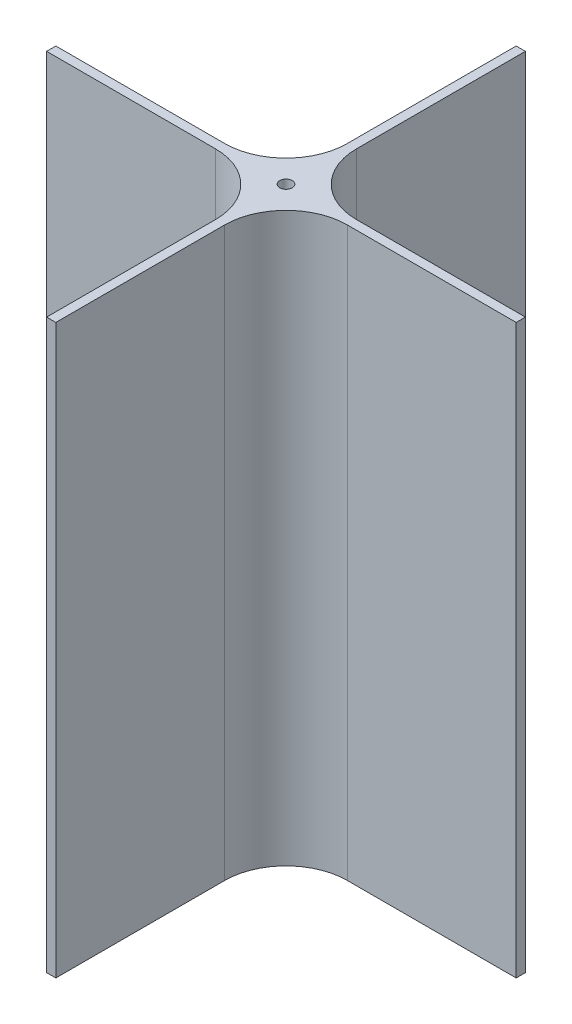
ISO-10303-21;
HEADER;
FILE_DESCRIPTION(('STEP AP214'),'2;1');
FILE_NAME('part.step','',(''),(''),'','','');
FILE_SCHEMA(('AUTOMOTIVE_DESIGN { 1 0 10303 214 1 1 1 1 }'));
ENDSEC;
DATA;
#1=APPLICATION_CONTEXT('core data for automotive mechanical design processes');
#2=APPLICATION_PROTOCOL_DEFINITION('international standard','automotive_design',2000,#1);
#3=PRODUCT_CONTEXT('',#1,'mechanical');
#4=PRODUCT('Part','Part','',(#3));
#5=PRODUCT_RELATED_PRODUCT_CATEGORY('part','',(#4));
#6=PRODUCT_DEFINITION_FORMATION('','',#4);
#7=PRODUCT_DEFINITION_CONTEXT('part definition',#1,'design');
#8=PRODUCT_DEFINITION('design','',#6,#7);
#9=PRODUCT_DEFINITION_SHAPE('','',#8);
#10=(LENGTH_UNIT() NAMED_UNIT(*) SI_UNIT(.MILLI.,.METRE.));
#11=(NAMED_UNIT(*) PLANE_ANGLE_UNIT() SI_UNIT($,.RADIAN.));
#12=(NAMED_UNIT(*) SI_UNIT($,.STERADIAN.) SOLID_ANGLE_UNIT());
#13=UNCERTAINTY_MEASURE_WITH_UNIT(LENGTH_MEASURE(1.E-05),#10,'distance_accuracy_value','');
#14=(GEOMETRIC_REPRESENTATION_CONTEXT(3) GLOBAL_UNCERTAINTY_ASSIGNED_CONTEXT((#13)) GLOBAL_UNIT_ASSIGNED_CONTEXT((#10,
#11,#12)) REPRESENTATION_CONTEXT('',''));
#15=CARTESIAN_POINT('',(0.,0.,0.));
#16=DIRECTION('',(0.,0.,1.));
#17=DIRECTION('',(1.,0.,0.));
#18=AXIS2_PLACEMENT_3D('',#15,#16,#17);
#19=CARTESIAN_POINT('',(-76.5,185.,-1.49999999999999));
#20=DIRECTION('',(0.,0.,1.));
#21=DIRECTION('',(1.,0.,0.));
#22=AXIS2_PLACEMENT_3D('',#19,#20,#21);
#23=PLANE('',#22);
#24=DIRECTION('',(-1.,0.,0.));
#25=VECTOR('',#24,1.);
#26=CARTESIAN_POINT('',(-76.5,185.,-1.49999999999999));
#27=LINE('',#26,#25);
#28=CARTESIAN_POINT('',(-21.5,185.,-1.5));
#29=VERTEX_POINT('',#28);
#30=CARTESIAN_POINT('',(-76.5,185.,-1.49999999999999));
#31=VERTEX_POINT('',#30);
#32=EDGE_CURVE('E242',#29,#31,#27,.T.);
#33=ORIENTED_EDGE('',*,*,#32,.F.);
#34=DIRECTION('',(0.,-1.,0.));
#35=VECTOR('',#34,1.);
#36=CARTESIAN_POINT('',(-21.5,0.,-1.5));
#37=LINE('',#36,#35);
#38=CARTESIAN_POINT('',(-21.5,0.,-1.5));
#39=VERTEX_POINT('',#38);
#40=EDGE_CURVE('E321',#29,#39,#37,.T.);
#41=ORIENTED_EDGE('',*,*,#40,.T.);
#42=DIRECTION('',(-1.,0.,0.));
#43=VECTOR('',#42,1.);
#44=CARTESIAN_POINT('',(-76.5,0.,-1.49999999999999));
#45=LINE('',#44,#43);
#46=CARTESIAN_POINT('',(-76.5,0.,-1.49999999999999));
#47=VERTEX_POINT('',#46);
#48=EDGE_CURVE('E239',#39,#47,#45,.T.);
#49=ORIENTED_EDGE('',*,*,#48,.T.);
#50=DIRECTION('',(0.,-1.,0.));
#51=VECTOR('',#50,1.);
#52=CARTESIAN_POINT('',(-76.5,185.,-1.49999999999999));
#53=LINE('',#52,#51);
#54=EDGE_CURVE('E318',#31,#47,#53,.T.);
#55=ORIENTED_EDGE('',*,*,#54,.F.);
#56=EDGE_LOOP('',(#33,#41,#49,#55));
#57=FACE_BOUND('',#56,.T.);
#58=ADVANCED_FACE('F38',(#57),#23,.F.);
#59=CARTESIAN_POINT('',(-76.5,185.,1.50000000000001));
#60=DIRECTION('',(1.,0.,0.));
#61=DIRECTION('',(0.,0.,-1.));
#62=AXIS2_PLACEMENT_3D('',#59,#60,#61);
#63=PLANE('',#62);
#64=DIRECTION('',(0.,0.,1.));
#65=VECTOR('',#64,1.);
#66=CARTESIAN_POINT('',(-76.5,0.,1.50000000000001));
#67=LINE('',#66,#65);
#68=CARTESIAN_POINT('',(-76.5,0.,1.50000000000001));
#69=VERTEX_POINT('',#68);
#70=EDGE_CURVE('E273',#47,#69,#67,.T.);
#71=ORIENTED_EDGE('',*,*,#70,.T.);
#72=DIRECTION('',(0.,-1.,0.));
#73=VECTOR('',#72,1.);
#74=CARTESIAN_POINT('',(-76.5,185.,1.50000000000001));
#75=LINE('',#74,#73);
#76=CARTESIAN_POINT('',(-76.5,185.,1.50000000000001));
#77=VERTEX_POINT('',#76);
#78=EDGE_CURVE('E315',#77,#69,#75,.T.);
#79=ORIENTED_EDGE('',*,*,#78,.F.);
#80=DIRECTION('',(0.,0.,1.));
#81=VECTOR('',#80,1.);
#82=CARTESIAN_POINT('',(-76.5,185.,1.50000000000001));
#83=LINE('',#82,#81);
#84=EDGE_CURVE('E244',#31,#77,#83,.T.);
#85=ORIENTED_EDGE('',*,*,#84,.F.);
#86=ORIENTED_EDGE('',*,*,#54,.T.);
#87=EDGE_LOOP('',(#71,#79,#85,#86));
#88=FACE_BOUND('',#87,.T.);
#89=ADVANCED_FACE('F427',(#88),#63,.F.);
#90=CARTESIAN_POINT('',(-1.5,185.,1.5));
#91=DIRECTION('',(0.,0.,-1.));
#92=DIRECTION('',(-1.,0.,0.));
#93=AXIS2_PLACEMENT_3D('',#90,#91,#92);
#94=PLANE('',#93);
#95=DIRECTION('',(1.,0.,0.));
#96=VECTOR('',#95,1.);
#97=CARTESIAN_POINT('',(-1.5,0.,1.5));
#98=LINE('',#97,#96);
#99=CARTESIAN_POINT('',(-21.5,0.,1.5));
#100=VERTEX_POINT('',#99);
#101=EDGE_CURVE('E275',#69,#100,#98,.T.);
#102=ORIENTED_EDGE('',*,*,#101,.T.);
#103=DIRECTION('',(0.,-1.,0.));
#104=VECTOR('',#103,1.);
#105=CARTESIAN_POINT('',(-21.5,185.,1.5));
#106=LINE('',#105,#104);
#107=CARTESIAN_POINT('',(-21.5,185.,1.5));
#108=VERTEX_POINT('',#107);
#109=EDGE_CURVE('E339',#100,#108,#106,.F.);
#110=ORIENTED_EDGE('',*,*,#109,.T.);
#111=DIRECTION('',(1.,0.,0.));
#112=VECTOR('',#111,1.);
#113=CARTESIAN_POINT('',(-1.5,185.,1.5));
#114=LINE('',#113,#112);
#115=EDGE_CURVE('E247',#77,#108,#114,.T.);
#116=ORIENTED_EDGE('',*,*,#115,.F.);
#117=ORIENTED_EDGE('',*,*,#78,.T.);
#118=EDGE_LOOP('',(#102,#110,#116,#117));
#119=FACE_BOUND('',#118,.T.);
#120=ADVANCED_FACE('F362',(#119),#94,.F.);
#121=CARTESIAN_POINT('',(-1.5,185.,76.5));
#122=DIRECTION('',(1.,0.,0.));
#123=DIRECTION('',(0.,0.,-1.));
#124=AXIS2_PLACEMENT_3D('',#121,#122,#123);
#125=PLANE('',#124);
#126=DIRECTION('',(0.,0.,1.));
#127=VECTOR('',#126,1.);
#128=CARTESIAN_POINT('',(-1.5,185.,76.5));
#129=LINE('',#128,#127);
#130=CARTESIAN_POINT('',(-1.5,185.,21.5));
#131=VERTEX_POINT('',#130);
#132=CARTESIAN_POINT('',(-1.5,185.,76.5));
#133=VERTEX_POINT('',#132);
#134=EDGE_CURVE('E250',#131,#133,#129,.T.);
#135=ORIENTED_EDGE('',*,*,#134,.F.);
#136=DIRECTION('',(0.,-1.,0.));
#137=VECTOR('',#136,1.);
#138=CARTESIAN_POINT('',(-1.5,0.,21.5));
#139=LINE('',#138,#137);
#140=CARTESIAN_POINT('',(-1.5,0.,21.5));
#141=VERTEX_POINT('',#140);
#142=EDGE_CURVE('E336',#131,#141,#139,.T.);
#143=ORIENTED_EDGE('',*,*,#142,.T.);
#144=DIRECTION('',(0.,0.,1.));
#145=VECTOR('',#144,1.);
#146=CARTESIAN_POINT('',(-1.5,0.,76.5));
#147=LINE('',#146,#145);
#148=CARTESIAN_POINT('',(-1.5,0.,76.5));
#149=VERTEX_POINT('',#148);
#150=EDGE_CURVE('E278',#141,#149,#147,.T.);
#151=ORIENTED_EDGE('',*,*,#150,.T.);
#152=DIRECTION('',(0.,-1.,0.));
#153=VECTOR('',#152,1.);
#154=CARTESIAN_POINT('',(-1.5,185.,76.5));
#155=LINE('',#154,#153);
#156=EDGE_CURVE('E312',#133,#149,#155,.T.);
#157=ORIENTED_EDGE('',*,*,#156,.F.);
#158=EDGE_LOOP('',(#135,#143,#151,#157));
#159=FACE_BOUND('',#158,.T.);
#160=ADVANCED_FACE('F371',(#159),#125,.F.);
#161=CARTESIAN_POINT('',(1.5,185.,76.5));
#162=DIRECTION('',(0.,0.,-1.));
#163=DIRECTION('',(-1.,0.,0.));
#164=AXIS2_PLACEMENT_3D('',#161,#162,#163);
#165=PLANE('',#164);
#166=DIRECTION('',(1.,0.,0.));
#167=VECTOR('',#166,1.);
#168=CARTESIAN_POINT('',(1.5,0.,76.5));
#169=LINE('',#168,#167);
#170=CARTESIAN_POINT('',(1.5,0.,76.5));
#171=VERTEX_POINT('',#170);
#172=EDGE_CURVE('E280',#149,#171,#169,.T.);
#173=ORIENTED_EDGE('',*,*,#172,.T.);
#174=DIRECTION('',(0.,-1.,0.));
#175=VECTOR('',#174,1.);
#176=CARTESIAN_POINT('',(1.5,185.,76.5));
#177=LINE('',#176,#175);
#178=CARTESIAN_POINT('',(1.5,185.,76.5));
#179=VERTEX_POINT('',#178);
#180=EDGE_CURVE('E309',#179,#171,#177,.T.);
#181=ORIENTED_EDGE('',*,*,#180,.F.);
#182=DIRECTION('',(1.,0.,0.));
#183=VECTOR('',#182,1.);
#184=CARTESIAN_POINT('',(1.5,185.,76.5));
#185=LINE('',#184,#183);
#186=EDGE_CURVE('E252',#133,#179,#185,.T.);
#187=ORIENTED_EDGE('',*,*,#186,.F.);
#188=ORIENTED_EDGE('',*,*,#156,.T.);
#189=EDGE_LOOP('',(#173,#181,#187,#188));
#190=FACE_BOUND('',#189,.T.);
#191=ADVANCED_FACE('F375',(#190),#165,.F.);
#192=CARTESIAN_POINT('',(1.5,185.,1.5));
#193=DIRECTION('',(-1.,0.,0.));
#194=DIRECTION('',(0.,0.,1.));
#195=AXIS2_PLACEMENT_3D('',#192,#193,#194);
#196=PLANE('',#195);
#197=DIRECTION('',(0.,0.,-1.));
#198=VECTOR('',#197,1.);
#199=CARTESIAN_POINT('',(1.5,0.,1.5));
#200=LINE('',#199,#198);
#201=CARTESIAN_POINT('',(1.5,0.,21.5));
#202=VERTEX_POINT('',#201);
#203=EDGE_CURVE('E282',#171,#202,#200,.T.);
#204=ORIENTED_EDGE('',*,*,#203,.T.);
#205=DIRECTION('',(0.,-1.,0.));
#206=VECTOR('',#205,1.);
#207=CARTESIAN_POINT('',(1.5,185.,21.5));
#208=LINE('',#207,#206);
#209=CARTESIAN_POINT('',(1.5,185.,21.5));
#210=VERTEX_POINT('',#209);
#211=EDGE_CURVE('E329',#202,#210,#208,.F.);
#212=ORIENTED_EDGE('',*,*,#211,.T.);
#213=DIRECTION('',(0.,0.,-1.));
#214=VECTOR('',#213,1.);
#215=CARTESIAN_POINT('',(1.5,185.,1.5));
#216=LINE('',#215,#214);
#217=EDGE_CURVE('E254',#179,#210,#216,.T.);
#218=ORIENTED_EDGE('',*,*,#217,.F.);
#219=ORIENTED_EDGE('',*,*,#180,.T.);
#220=EDGE_LOOP('',(#204,#212,#218,#219));
#221=FACE_BOUND('',#220,.T.);
#222=ADVANCED_FACE('F505',(#221),#196,.F.);
#223=CARTESIAN_POINT('',(76.5,185.,1.49999999999999));
#224=DIRECTION('',(0.,0.,-1.));
#225=DIRECTION('',(-1.,0.,0.));
#226=AXIS2_PLACEMENT_3D('',#223,#224,#225);
#227=PLANE('',#226);
#228=DIRECTION('',(1.,0.,0.));
#229=VECTOR('',#228,1.);
#230=CARTESIAN_POINT('',(76.5,185.,1.49999999999999));
#231=LINE('',#230,#229);
#232=CARTESIAN_POINT('',(21.5,185.,1.5));
#233=VERTEX_POINT('',#232);
#234=CARTESIAN_POINT('',(76.5,185.,1.49999999999999));
#235=VERTEX_POINT('',#234);
#236=EDGE_CURVE('E257',#233,#235,#231,.T.);
#237=ORIENTED_EDGE('',*,*,#236,.F.);
#238=DIRECTION('',(0.,-1.,0.));
#239=VECTOR('',#238,1.);
#240=CARTESIAN_POINT('',(21.5,0.,1.5));
#241=LINE('',#240,#239);
#242=CARTESIAN_POINT('',(21.5,0.,1.5));
#243=VERTEX_POINT('',#242);
#244=EDGE_CURVE('E326',#233,#243,#241,.T.);
#245=ORIENTED_EDGE('',*,*,#244,.T.);
#246=DIRECTION('',(1.,0.,0.));
#247=VECTOR('',#246,1.);
#248=CARTESIAN_POINT('',(76.5,0.,1.49999999999999));
#249=LINE('',#248,#247);
#250=CARTESIAN_POINT('',(76.5,0.,1.49999999999999));
#251=VERTEX_POINT('',#250);
#252=EDGE_CURVE('E285',#243,#251,#249,.T.);
#253=ORIENTED_EDGE('',*,*,#252,.T.);
#254=DIRECTION('',(0.,-1.,0.));
#255=VECTOR('',#254,1.);
#256=CARTESIAN_POINT('',(76.5,185.,1.49999999999999));
#257=LINE('',#256,#255);
#258=EDGE_CURVE('E306',#235,#251,#257,.T.);
#259=ORIENTED_EDGE('',*,*,#258,.F.);
#260=EDGE_LOOP('',(#237,#245,#253,#259));
#261=FACE_BOUND('',#260,.T.);
#262=ADVANCED_FACE('F386',(#261),#227,.F.);
#263=CARTESIAN_POINT('',(76.5,185.,-1.50000000000001));
#264=DIRECTION('',(-1.,0.,0.));
#265=DIRECTION('',(0.,0.,1.));
#266=AXIS2_PLACEMENT_3D('',#263,#264,#265);
#267=PLANE('',#266);
#268=DIRECTION('',(0.,0.,-1.));
#269=VECTOR('',#268,1.);
#270=CARTESIAN_POINT('',(76.5,0.,-1.50000000000001));
#271=LINE('',#270,#269);
#272=CARTESIAN_POINT('',(76.5,0.,-1.50000000000001));
#273=VERTEX_POINT('',#272);
#274=EDGE_CURVE('E287',#251,#273,#271,.T.);
#275=ORIENTED_EDGE('',*,*,#274,.T.);
#276=DIRECTION('',(0.,-1.,0.));
#277=VECTOR('',#276,1.);
#278=CARTESIAN_POINT('',(76.5,185.,-1.50000000000001));
#279=LINE('',#278,#277);
#280=CARTESIAN_POINT('',(76.5,185.,-1.50000000000001));
#281=VERTEX_POINT('',#280);
#282=EDGE_CURVE('E303',#281,#273,#279,.T.);
#283=ORIENTED_EDGE('',*,*,#282,.F.);
#284=DIRECTION('',(0.,0.,-1.));
#285=VECTOR('',#284,1.);
#286=CARTESIAN_POINT('',(76.5,185.,-1.50000000000001));
#287=LINE('',#286,#285);
#288=EDGE_CURVE('E259',#235,#281,#287,.T.);
#289=ORIENTED_EDGE('',*,*,#288,.F.);
#290=ORIENTED_EDGE('',*,*,#258,.T.);
#291=EDGE_LOOP('',(#275,#283,#289,#290));
#292=FACE_BOUND('',#291,.T.);
#293=ADVANCED_FACE('F393',(#292),#267,.F.);
#294=CARTESIAN_POINT('',(1.5,185.,-1.49999999999998));
#295=DIRECTION('',(0.,0.,1.));
#296=DIRECTION('',(1.,0.,0.));
#297=AXIS2_PLACEMENT_3D('',#294,#295,#296);
#298=PLANE('',#297);
#299=DIRECTION('',(-1.,0.,0.));
#300=VECTOR('',#299,1.);
#301=CARTESIAN_POINT('',(1.5,0.,-1.49999999999998));
#302=LINE('',#301,#300);
#303=CARTESIAN_POINT('',(21.5,0.,-1.49999999999999));
#304=VERTEX_POINT('',#303);
#305=EDGE_CURVE('E289',#273,#304,#302,.T.);
#306=ORIENTED_EDGE('',*,*,#305,.T.);
#307=DIRECTION('',(0.,-1.,0.));
#308=VECTOR('',#307,1.);
#309=CARTESIAN_POINT('',(21.5,185.,-1.49999999999999));
#310=LINE('',#309,#308);
#311=CARTESIAN_POINT('',(21.5,185.,-1.49999999999999));
#312=VERTEX_POINT('',#311);
#313=EDGE_CURVE('E334',#304,#312,#310,.F.);
#314=ORIENTED_EDGE('',*,*,#313,.T.);
#315=DIRECTION('',(-1.,0.,0.));
#316=VECTOR('',#315,1.);
#317=CARTESIAN_POINT('',(1.5,185.,-1.49999999999998));
#318=LINE('',#317,#316);
#319=EDGE_CURVE('E261',#281,#312,#318,.T.);
#320=ORIENTED_EDGE('',*,*,#319,.F.);
#321=ORIENTED_EDGE('',*,*,#282,.T.);
#322=EDGE_LOOP('',(#306,#314,#320,#321));
#323=FACE_BOUND('',#322,.T.);
#324=ADVANCED_FACE('F397',(#323),#298,.F.);
#325=CARTESIAN_POINT('',(1.5,185.,-76.5));
#326=DIRECTION('',(-1.,0.,0.));
#327=DIRECTION('',(0.,0.,1.));
#328=AXIS2_PLACEMENT_3D('',#325,#326,#327);
#329=PLANE('',#328);
#330=DIRECTION('',(0.,0.,-1.));
#331=VECTOR('',#330,1.);
#332=CARTESIAN_POINT('',(1.5,185.,-76.5));
#333=LINE('',#332,#331);
#334=CARTESIAN_POINT('',(1.5,185.,-21.5));
#335=VERTEX_POINT('',#334);
#336=CARTESIAN_POINT('',(1.5,185.,-76.5));
#337=VERTEX_POINT('',#336);
#338=EDGE_CURVE('E264',#335,#337,#333,.T.);
#339=ORIENTED_EDGE('',*,*,#338,.F.);
#340=DIRECTION('',(0.,-1.,0.));
#341=VECTOR('',#340,1.);
#342=CARTESIAN_POINT('',(1.5,0.,-21.5));
#343=LINE('',#342,#341);
#344=CARTESIAN_POINT('',(1.5,0.,-21.5));
#345=VERTEX_POINT('',#344);
#346=EDGE_CURVE('E331',#335,#345,#343,.T.);
#347=ORIENTED_EDGE('',*,*,#346,.T.);
#348=DIRECTION('',(0.,0.,-1.));
#349=VECTOR('',#348,1.);
#350=CARTESIAN_POINT('',(1.5,0.,-76.5));
#351=LINE('',#350,#349);
#352=CARTESIAN_POINT('',(1.5,0.,-76.5));
#353=VERTEX_POINT('',#352);
#354=EDGE_CURVE('E292',#345,#353,#351,.T.);
#355=ORIENTED_EDGE('',*,*,#354,.T.);
#356=DIRECTION('',(0.,-1.,0.));
#357=VECTOR('',#356,1.);
#358=CARTESIAN_POINT('',(1.5,185.,-76.5));
#359=LINE('',#358,#357);
#360=EDGE_CURVE('E300',#337,#353,#359,.T.);
#361=ORIENTED_EDGE('',*,*,#360,.F.);
#362=EDGE_LOOP('',(#339,#347,#355,#361));
#363=FACE_BOUND('',#362,.T.);
#364=ADVANCED_FACE('F406',(#363),#329,.F.);
#365=CARTESIAN_POINT('',(-1.5,185.,-76.5));
#366=DIRECTION('',(0.,0.,1.));
#367=DIRECTION('',(1.,0.,0.));
#368=AXIS2_PLACEMENT_3D('',#365,#366,#367);
#369=PLANE('',#368);
#370=DIRECTION('',(-1.,0.,0.));
#371=VECTOR('',#370,1.);
#372=CARTESIAN_POINT('',(-1.5,0.,-76.5));
#373=LINE('',#372,#371);
#374=CARTESIAN_POINT('',(-1.5,0.,-76.5));
#375=VERTEX_POINT('',#374);
#376=EDGE_CURVE('E294',#353,#375,#373,.T.);
#377=ORIENTED_EDGE('',*,*,#376,.T.);
#378=DIRECTION('',(0.,-1.,0.));
#379=VECTOR('',#378,1.);
#380=CARTESIAN_POINT('',(-1.5,185.,-76.5));
#381=LINE('',#380,#379);
#382=CARTESIAN_POINT('',(-1.5,185.,-76.5));
#383=VERTEX_POINT('',#382);
#384=EDGE_CURVE('E271',#383,#375,#381,.T.);
#385=ORIENTED_EDGE('',*,*,#384,.F.);
#386=DIRECTION('',(-1.,0.,0.));
#387=VECTOR('',#386,1.);
#388=CARTESIAN_POINT('',(-1.5,185.,-76.5));
#389=LINE('',#388,#387);
#390=EDGE_CURVE('E266',#337,#383,#389,.T.);
#391=ORIENTED_EDGE('',*,*,#390,.F.);
#392=ORIENTED_EDGE('',*,*,#360,.T.);
#393=EDGE_LOOP('',(#377,#385,#391,#392));
#394=FACE_BOUND('',#393,.T.);
#395=ADVANCED_FACE('F412',(#394),#369,.F.);
#396=CARTESIAN_POINT('',(-1.5,185.,-1.5));
#397=DIRECTION('',(1.,0.,0.));
#398=DIRECTION('',(0.,0.,-1.));
#399=AXIS2_PLACEMENT_3D('',#396,#397,#398);
#400=PLANE('',#399);
#401=DIRECTION('',(0.,0.,1.));
#402=VECTOR('',#401,1.);
#403=CARTESIAN_POINT('',(-1.5,0.,-1.5));
#404=LINE('',#403,#402);
#405=CARTESIAN_POINT('',(-1.5,0.,-21.5));
#406=VERTEX_POINT('',#405);
#407=EDGE_CURVE('E245',#375,#406,#404,.T.);
#408=ORIENTED_EDGE('',*,*,#407,.T.);
#409=DIRECTION('',(0.,-1.,0.));
#410=VECTOR('',#409,1.);
#411=CARTESIAN_POINT('',(-1.5,185.,-21.5));
#412=LINE('',#411,#410);
#413=CARTESIAN_POINT('',(-1.5,185.,-21.5));
#414=VERTEX_POINT('',#413);
#415=EDGE_CURVE('E324',#406,#414,#412,.F.);
#416=ORIENTED_EDGE('',*,*,#415,.T.);
#417=DIRECTION('',(0.,0.,1.));
#418=VECTOR('',#417,1.);
#419=CARTESIAN_POINT('',(-1.5,185.,-1.5));
#420=LINE('',#419,#418);
#421=EDGE_CURVE('E268',#383,#414,#420,.T.);
#422=ORIENTED_EDGE('',*,*,#421,.F.);
#423=ORIENTED_EDGE('',*,*,#384,.T.);
#424=EDGE_LOOP('',(#408,#416,#422,#423));
#425=FACE_BOUND('',#424,.T.);
#426=ADVANCED_FACE('F416',(#425),#400,.F.);
#427=CARTESIAN_POINT('',(0.,185.,0.));
#428=DIRECTION('',(0.,1.,0.));
#429=DIRECTION('',(0.,0.,1.));
#430=AXIS2_PLACEMENT_3D('',#427,#428,#429);
#431=PLANE('',#430);
#432=CARTESIAN_POINT('',(0.,185.,0.));
#433=DIRECTION('',(0.,1.,0.));
#434=DIRECTION('',(0.,0.,1.));
#435=AXIS2_PLACEMENT_3D('',#432,#433,#434);
#436=CIRCLE('',#435,2.05);
#437=CARTESIAN_POINT('',(0.,185.,2.05));
#438=VERTEX_POINT('',#437);
#439=EDGE_CURVE('E692',#438,#438,#436,.T.);
#440=ORIENTED_EDGE('',*,*,#439,.F.);
#441=EDGE_LOOP('',(#440));
#442=FACE_BOUND('',#441,.T.);
#443=ORIENTED_EDGE('',*,*,#421,.T.);
#444=CARTESIAN_POINT('',(-21.5,185.,-21.5));
#445=DIRECTION('',(0.,1.,0.));
#446=DIRECTION('',(0.,0.,1.));
#447=AXIS2_PLACEMENT_3D('',#444,#445,#446);
#448=CIRCLE('',#447,20.);
#449=EDGE_CURVE('E343',#414,#29,#448,.F.);
#450=ORIENTED_EDGE('',*,*,#449,.T.);
#451=ORIENTED_EDGE('',*,*,#32,.T.);
#452=ORIENTED_EDGE('',*,*,#84,.T.);
#453=ORIENTED_EDGE('',*,*,#115,.T.);
#454=CARTESIAN_POINT('',(-21.5,185.,21.5));
#455=DIRECTION('',(0.,1.,0.));
#456=DIRECTION('',(0.,0.,1.));
#457=AXIS2_PLACEMENT_3D('',#454,#455,#456);
#458=CIRCLE('',#457,20.);
#459=EDGE_CURVE('E11',#108,#131,#458,.F.);
#460=ORIENTED_EDGE('',*,*,#459,.T.);
#461=ORIENTED_EDGE('',*,*,#134,.T.);
#462=ORIENTED_EDGE('',*,*,#186,.T.);
#463=ORIENTED_EDGE('',*,*,#217,.T.);
#464=CARTESIAN_POINT('',(21.5,185.,21.5));
#465=DIRECTION('',(0.,1.,0.));
#466=DIRECTION('',(0.,0.,1.));
#467=AXIS2_PLACEMENT_3D('',#464,#465,#466);
#468=CIRCLE('',#467,20.);
#469=EDGE_CURVE('E347',#210,#233,#468,.F.);
#470=ORIENTED_EDGE('',*,*,#469,.T.);
#471=ORIENTED_EDGE('',*,*,#236,.T.);
#472=ORIENTED_EDGE('',*,*,#288,.T.);
#473=ORIENTED_EDGE('',*,*,#319,.T.);
#474=CARTESIAN_POINT('',(21.5,185.,-21.5));
#475=DIRECTION('',(0.,1.,0.));
#476=DIRECTION('',(0.,0.,1.));
#477=AXIS2_PLACEMENT_3D('',#474,#475,#476);
#478=CIRCLE('',#477,20.);
#479=EDGE_CURVE('E351',#312,#335,#478,.F.);
#480=ORIENTED_EDGE('',*,*,#479,.T.);
#481=ORIENTED_EDGE('',*,*,#338,.T.);
#482=ORIENTED_EDGE('',*,*,#390,.T.);
#483=EDGE_LOOP('',(#443,#450,#451,#452,#453,#460,#461,#462,#463,#470,#471,#472,#473,#480,#481,#482));
#484=FACE_BOUND('',#483,.T.);
#485=ADVANCED_FACE('F368',(#442,#484),#431,.T.);
#486=CARTESIAN_POINT('',(0.,0.,0.));
#487=DIRECTION('',(0.,1.,0.));
#488=DIRECTION('',(0.,0.,1.));
#489=AXIS2_PLACEMENT_3D('',#486,#487,#488);
#490=PLANE('',#489);
#491=DIRECTION('',(0.707106781186547,0.,-0.707106781186548));
#492=VECTOR('',#491,1.);
#493=CARTESIAN_POINT('',(-4.59619407771256,0.,-1.76776695296637));
#494=LINE('',#493,#492);
#495=CARTESIAN_POINT('',(-4.59619407771256,0.,-1.76776695296637));
#496=VERTEX_POINT('',#495);
#497=CARTESIAN_POINT('',(-1.76776695296637,0.,-4.59619407771256));
#498=VERTEX_POINT('',#497);
#499=EDGE_CURVE('E209',#496,#498,#494,.T.);
#500=ORIENTED_EDGE('',*,*,#499,.F.);
#501=DIRECTION('',(-0.707106781186546,0.,-0.707106781186549));
#502=VECTOR('',#501,1.);
#503=CARTESIAN_POINT('',(-3.88908729652601,0.,-1.06066017177982));
#504=LINE('',#503,#502);
#505=CARTESIAN_POINT('',(-3.88908729652601,0.,-1.06066017177982));
#506=VERTEX_POINT('',#505);
#507=EDGE_CURVE('E58',#506,#496,#504,.T.);
#508=ORIENTED_EDGE('',*,*,#507,.F.);
#509=DIRECTION('',(-0.707106781186547,0.,0.707106781186548));
#510=VECTOR('',#509,1.);
#511=CARTESIAN_POINT('',(-3.88908729652601,0.,-1.06066017177982));
#512=LINE('',#511,#510);
#513=CARTESIAN_POINT('',(-1.06066017177982,0.,-3.88908729652601));
#514=VERTEX_POINT('',#513);
#515=EDGE_CURVE('E198',#514,#506,#512,.T.);
#516=ORIENTED_EDGE('',*,*,#515,.F.);
#517=DIRECTION('',(0.707106781186548,0.,0.707106781186547));
#518=VECTOR('',#517,1.);
#519=CARTESIAN_POINT('',(-1.06066017177982,0.,-3.88908729652601));
#520=LINE('',#519,#518);
#521=EDGE_CURVE('E203',#498,#514,#520,.T.);
#522=ORIENTED_EDGE('',*,*,#521,.F.);
#523=EDGE_LOOP('',(#500,#508,#516,#522));
#524=FACE_BOUND('',#523,.T.);
#525=DIRECTION('',(0.707106781186548,0.,-0.707106781186548));
#526=VECTOR('',#525,1.);
#527=CARTESIAN_POINT('',(-1.99607451847331,0.,-0.125245825086335));
#528=LINE('',#527,#526);
#529=CARTESIAN_POINT('',(-1.99607451847331,0.,-0.125245825086335));
#530=VERTEX_POINT('',#529);
#531=CARTESIAN_POINT('',(-0.125245825086335,0.,-1.99607451847331));
#532=VERTEX_POINT('',#531);
#533=EDGE_CURVE('E212',#530,#532,#528,.T.);
#534=ORIENTED_EDGE('',*,*,#533,.F.);
#535=CARTESIAN_POINT('',(0.,0.,0.));
#536=DIRECTION('',(0.,-1.,0.));
#537=DIRECTION('',(0.,0.,1.));
#538=AXIS2_PLACEMENT_3D('',#535,#536,#537);
#539=CIRCLE('',#538,2.);
#540=EDGE_CURVE('E210',#532,#530,#539,.T.);
#541=ORIENTED_EDGE('',*,*,#540,.F.);
#542=EDGE_LOOP('',(#534,#541));
#543=FACE_BOUND('',#542,.T.);
#544=ORIENTED_EDGE('',*,*,#48,.F.);
#545=CARTESIAN_POINT('',(-21.5,0.,-21.5));
#546=DIRECTION('',(0.,1.,0.));
#547=DIRECTION('',(0.,0.,1.));
#548=AXIS2_PLACEMENT_3D('',#545,#546,#547);
#549=CIRCLE('',#548,20.);
#550=EDGE_CURVE('E341',#39,#406,#549,.T.);
#551=ORIENTED_EDGE('',*,*,#550,.T.);
#552=ORIENTED_EDGE('',*,*,#407,.F.);
#553=ORIENTED_EDGE('',*,*,#376,.F.);
#554=ORIENTED_EDGE('',*,*,#354,.F.);
#555=CARTESIAN_POINT('',(21.5,0.,-21.5));
#556=DIRECTION('',(0.,1.,0.));
#557=DIRECTION('',(0.,0.,1.));
#558=AXIS2_PLACEMENT_3D('',#555,#556,#557);
#559=CIRCLE('',#558,20.);
#560=EDGE_CURVE('E349',#345,#304,#559,.T.);
#561=ORIENTED_EDGE('',*,*,#560,.T.);
#562=ORIENTED_EDGE('',*,*,#305,.F.);
#563=ORIENTED_EDGE('',*,*,#274,.F.);
#564=ORIENTED_EDGE('',*,*,#252,.F.);
#565=CARTESIAN_POINT('',(21.5,0.,21.5));
#566=DIRECTION('',(0.,1.,0.));
#567=DIRECTION('',(0.,0.,1.));
#568=AXIS2_PLACEMENT_3D('',#565,#566,#567);
#569=CIRCLE('',#568,20.);
#570=EDGE_CURVE('E345',#243,#202,#569,.T.);
#571=ORIENTED_EDGE('',*,*,#570,.T.);
#572=ORIENTED_EDGE('',*,*,#203,.F.);
#573=ORIENTED_EDGE('',*,*,#172,.F.);
#574=ORIENTED_EDGE('',*,*,#150,.F.);
#575=CARTESIAN_POINT('',(-21.5,0.,21.5));
#576=DIRECTION('',(0.,1.,0.));
#577=DIRECTION('',(0.,0.,1.));
#578=AXIS2_PLACEMENT_3D('',#575,#576,#577);
#579=CIRCLE('',#578,20.);
#580=EDGE_CURVE('E46',#141,#100,#579,.T.);
#581=ORIENTED_EDGE('',*,*,#580,.T.);
#582=ORIENTED_EDGE('',*,*,#101,.F.);
#583=ORIENTED_EDGE('',*,*,#70,.F.);
#584=EDGE_LOOP('',(#544,#551,#552,#553,#554,#561,#562,#563,#564,#571,#572,#573,#574,#581,#582,#583));
#585=FACE_BOUND('',#584,.T.);
#586=ADVANCED_FACE('F206',(#524,#543,#585),#490,.F.);
#587=CARTESIAN_POINT('',(-21.5,185.,-21.5));
#588=DIRECTION('',(0.,1.,0.));
#589=DIRECTION('',(0.,0.,1.));
#590=AXIS2_PLACEMENT_3D('',#587,#588,#589);
#591=CYLINDRICAL_SURFACE('',#590,20.);
#592=CARTESIAN_POINT('',(-6.33703505204973,11.5,-8.45835539560937));
#593=CARTESIAN_POINT('',(-6.33703712926371,11.5841284342779,-8.45835225839734));
#594=CARTESIAN_POINT('',(-6.34167603836318,11.6683148517946,-8.45295349618822));
#595=CARTESIAN_POINT('',(-6.36014533781777,11.8343604156479,-8.43152674774005));
#596=CARTESIAN_POINT('',(-6.37398626615615,11.916216781448,-8.41548657519849));
#597=CARTESIAN_POINT('',(-6.41055160961536,12.0751731834304,-8.37333549201604));
#598=CARTESIAN_POINT('',(-6.43327113927213,12.1522758083992,-8.34723011987233));
#599=CARTESIAN_POINT('',(-6.48708294795988,12.2995725054576,-8.28584169789606));
#600=CARTESIAN_POINT('',(-6.51817338188287,12.3697680953403,-8.25056067061234));
#601=CARTESIAN_POINT('',(-6.58809193527995,12.5014250237837,-8.17191825064202));
#602=CARTESIAN_POINT('',(-6.6269343646166,12.5628698438958,-8.12854192411922));
#603=CARTESIAN_POINT('',(-6.7114175743495,12.6751393246477,-8.03516484620577));
#604=CARTESIAN_POINT('',(-6.75705864571671,12.7259635305186,-7.98516381129839));
#605=CARTESIAN_POINT('',(-6.85409278915979,12.8156025520847,-7.88006919126899));
#606=CARTESIAN_POINT('',(-6.90549250538288,12.8544032970946,-7.82496973677145));
#607=CARTESIAN_POINT('',(-7.0127004065499,12.9188039621204,-7.71144534621452));
#608=CARTESIAN_POINT('',(-7.06850852735361,12.9444040741587,-7.65302045854209));
#609=CARTESIAN_POINT('',(-7.18294653010925,12.9816298393045,-7.53473109360844));
#610=CARTESIAN_POINT('',(-7.24157085547582,12.993281922978,-7.47486955907031));
#611=CARTESIAN_POINT('',(-7.3601209658428,13.0023625422242,-7.35535776544098));
#612=CARTESIAN_POINT('',(-7.42004673076131,12.9997912971151,-7.29570750310624));
#613=CARTESIAN_POINT('',(-7.53935929035906,12.9805199391459,-7.17842547535357));
#614=CARTESIAN_POINT('',(-7.59874692658824,12.9638482511579,-7.12078989180509));
#615=CARTESIAN_POINT('',(-7.71535008395794,12.9168934161016,-7.0089697964229));
#616=CARTESIAN_POINT('',(-7.77256558778684,12.8866101605754,-6.9547853120917));
#617=CARTESIAN_POINT('',(-7.88313957692395,12.8132599198167,-6.85121633242543));
#618=CARTESIAN_POINT('',(-7.93649413472237,12.770180138609,-6.80183670767131));
#619=CARTESIAN_POINT('',(-8.03761659489004,12.6724690194077,-6.70916010218498));
#620=CARTESIAN_POINT('',(-8.08538440580609,12.6178374923569,-6.66586322102294));
#621=CARTESIAN_POINT('',(-8.17391341783559,12.4984133203426,-6.5862822819194));
#622=CARTESIAN_POINT('',(-8.21465707783906,12.4335959880841,-6.55001575328221));
#623=CARTESIAN_POINT('',(-8.28765155345045,12.2957263626712,-6.48546602707335));
#624=CARTESIAN_POINT('',(-8.31990236383221,12.2226740644494,-6.45718283441432));
#625=CARTESIAN_POINT('',(-8.3748268951401,12.0703914956252,-6.40923571162481));
#626=CARTESIAN_POINT('',(-8.39749973657049,11.9911606584703,-6.38957257302342));
#627=CARTESIAN_POINT('',(-8.43248369986569,11.8287779193907,-6.35930789275771));
#628=CARTESIAN_POINT('',(-8.44479499773899,11.7456260840961,-6.34870619716929));
#629=CARTESIAN_POINT('',(-8.45861013232855,11.5779784230925,-6.33681316755184));
#630=CARTESIAN_POINT('',(-8.46014020534824,11.4934863619084,-6.3354992315689));
#631=CARTESIAN_POINT('',(-8.45240898399543,11.3253662401495,-6.34215075703336));
#632=CARTESIAN_POINT('',(-8.44314777090156,11.2417381730719,-6.35011614859002));
#633=CARTESIAN_POINT('',(-8.41417346863108,11.0778184266437,-6.3751361689459));
#634=CARTESIAN_POINT('',(-8.39447250052503,10.9975229942843,-6.39218025704939));
#635=CARTESIAN_POINT('',(-8.34530206789419,10.8424317326262,-6.43497499321765));
#636=CARTESIAN_POINT('',(-8.31583247603908,10.7676359750293,-6.4607257547707));
#637=CARTESIAN_POINT('',(-8.24805160328187,10.6255089474427,-6.52041725489354));
#638=CARTESIAN_POINT('',(-8.20972338978165,10.558192342898,-6.55437368372266));
#639=CARTESIAN_POINT('',(-8.12552329586773,10.4330825017566,-6.62967537236181));
#640=CARTESIAN_POINT('',(-8.07965131002981,10.3752893982734,-6.6710207354329));
#641=CARTESIAN_POINT('',(-7.98174587625321,10.2707497478921,-6.76021739619111));
#642=CARTESIAN_POINT('',(-7.92970024964255,10.224025599306,-6.8080815819818));
#643=CARTESIAN_POINT('',(-7.82116893872343,10.1431036849061,-6.90907583037006));
#644=CARTESIAN_POINT('',(-7.76468329148663,10.1089058145186,-6.96220584900188));
#645=CARTESIAN_POINT('',(-7.64907582309151,10.054045891645,-7.07230927970189));
#646=CARTESIAN_POINT('',(-7.58995679465045,10.0333698477908,-7.12927865153237));
#647=CARTESIAN_POINT('',(-7.47080168236272,10.0060947402999,-7.24557884889888));
#648=CARTESIAN_POINT('',(-7.41076561226412,9.99949546583585,-7.30490963905447));
#649=CARTESIAN_POINT('',(-7.29166670132805,10.0005634872108,-7.42412180531184));
#650=CARTESIAN_POINT('',(-7.23260183382245,10.0081958145637,-7.48400147309331));
#651=CARTESIAN_POINT('',(-7.11693790627974,10.0374376438315,-7.60271984280499));
#652=CARTESIAN_POINT('',(-7.06033885007254,10.0590471674549,-7.66155854311829));
#653=CARTESIAN_POINT('',(-6.95111677620615,10.1156214805433,-7.77643327365177));
#654=CARTESIAN_POINT('',(-6.8984936287844,10.1505858339183,-7.8324693953201));
#655=CARTESIAN_POINT('',(-6.79856099875894,10.2328730327535,-7.94001892068508));
#656=CARTESIAN_POINT('',(-6.75125140892833,10.2801956287618,-7.99153241564316));
#657=CARTESIAN_POINT('',(-6.6629922619678,10.3859868107583,-8.08853031667638));
#658=CARTESIAN_POINT('',(-6.62205777640821,10.4444811031118,-8.1340003992616));
#659=CARTESIAN_POINT('',(-6.54763524633901,10.5709123645285,-8.21730759441341));
#660=CARTESIAN_POINT('',(-6.5141490155776,10.6388516270356,-8.25514284759078));
#661=CARTESIAN_POINT('',(-6.45535424020068,10.782352308282,-8.32196432589576));
#662=CARTESIAN_POINT('',(-6.43005882382869,10.8579257112035,-8.35093634095488));
#663=CARTESIAN_POINT('',(-6.38830918305775,11.0144092289357,-8.39893813042022));
#664=CARTESIAN_POINT('',(-6.37184471083729,11.0953130351023,-8.41797942816099));
#665=CARTESIAN_POINT('',(-6.35234274897355,11.2305849851549,-8.44057402410492));
#666=CARTESIAN_POINT('',(-6.34660840565053,11.2840811300014,-8.44723178310961));
#667=CARTESIAN_POINT('',(-6.33895389260043,11.3917101746565,-8.45612347399188));
#668=CARTESIAN_POINT('',(-6.33703371486182,11.4458430731275,-8.45835741516155));
#669=CARTESIAN_POINT('',(-6.33703505204973,11.5,-8.45835539560937));
#670=B_SPLINE_CURVE_WITH_KNOTS('',3,(#592,#593,#594,#595,#596,#597,#598,#599,#600,#601,#602,
#603,#604,#605,#606,#607,#608,#609,#610,#611,#612,#613,#614,#615,#616,#617,#618,#619,#620,#621,
#622,#623,#624,#625,#626,#627,#628,#629,#630,#631,#632,#633,#634,#635,#636,#637,#638,#639,#640,
#641,#642,#643,#644,#645,#646,#647,#648,#649,#650,#651,#652,#653,#654,#655,#656,#657,#658,#659,
#660,#661,#662,#663,#664,#665,#666,#667,#668,#669),.UNSPECIFIED.,.T.,.F.,(4,2,2,2,2,2,2,2,2,2,2,
2,2,2,2,2,2,2,2,2,2,2,2,2,2,2,2,2,2,2,2,2,2,2,2,2,2,2,4),(0.,0.252187579339041,
0.504664457860797,0.75700260576219,1.00928517896143,1.26203783609002,1.5148013137358,
1.76785948521026,2.02091397548469,2.27348818174161,2.52605849341277,2.7781208625958,
3.03018524026398,3.28250252487075,3.53482393925043,3.7877666140638,4.04070944452773,
4.29367549638821,4.54663725110238,4.79898320559482,5.0513272594613,5.30337896930957,
5.55543396468601,5.80797478825659,6.06051914138529,6.31357024084872,6.5666192277034,
6.8194059624945,7.07218891127965,7.32435156508921,7.57651461054472,7.82866942254427,
8.08081914517807,8.3335562178414,8.58635476809665,8.83955652118654,9.09246380844972,
9.25480764733516,9.41715114522214),.UNSPECIFIED.);
#671=CARTESIAN_POINT('',(-6.33703505204973,11.5,-8.45835539560937));
#672=VERTEX_POINT('',#671);
#673=EDGE_CURVE('E195',#672,#672,#670,.T.);
#674=ORIENTED_EDGE('',*,*,#673,.T.);
#675=EDGE_LOOP('',(#674));
#676=FACE_BOUND('',#675,.T.);
#677=ORIENTED_EDGE('',*,*,#449,.F.);
#678=ORIENTED_EDGE('',*,*,#415,.F.);
#679=ORIENTED_EDGE('',*,*,#550,.F.);
#680=ORIENTED_EDGE('',*,*,#40,.F.);
#681=EDGE_LOOP('',(#677,#678,#679,#680));
#682=FACE_BOUND('',#681,.T.);
#683=ADVANCED_FACE('F422',(#676,#682),#591,.F.);
#684=CARTESIAN_POINT('',(21.5,185.,21.5));
#685=DIRECTION('',(0.,1.,0.));
#686=DIRECTION('',(0.,0.,1.));
#687=AXIS2_PLACEMENT_3D('',#684,#685,#686);
#688=CYLINDRICAL_SURFACE('',#687,20.);
#689=ORIENTED_EDGE('',*,*,#469,.F.);
#690=ORIENTED_EDGE('',*,*,#211,.F.);
#691=ORIENTED_EDGE('',*,*,#570,.F.);
#692=ORIENTED_EDGE('',*,*,#244,.F.);
#693=EDGE_LOOP('',(#689,#690,#691,#692));
#694=FACE_BOUND('',#693,.T.);
#695=ADVANCED_FACE('F383',(#694),#688,.F.);
#696=CARTESIAN_POINT('',(21.5,185.,-21.5));
#697=DIRECTION('',(0.,1.,0.));
#698=DIRECTION('',(0.,0.,1.));
#699=AXIS2_PLACEMENT_3D('',#696,#697,#698);
#700=CYLINDRICAL_SURFACE('',#699,20.);
#701=ORIENTED_EDGE('',*,*,#479,.F.);
#702=ORIENTED_EDGE('',*,*,#313,.F.);
#703=ORIENTED_EDGE('',*,*,#560,.F.);
#704=ORIENTED_EDGE('',*,*,#346,.F.);
#705=EDGE_LOOP('',(#701,#702,#703,#704));
#706=FACE_BOUND('',#705,.T.);
#707=ADVANCED_FACE('F403',(#706),#700,.F.);
#708=CARTESIAN_POINT('',(-21.5,185.,21.5));
#709=DIRECTION('',(0.,1.,0.));
#710=DIRECTION('',(0.,0.,1.));
#711=AXIS2_PLACEMENT_3D('',#708,#709,#710);
#712=CYLINDRICAL_SURFACE('',#711,20.);
#713=ORIENTED_EDGE('',*,*,#459,.F.);
#714=ORIENTED_EDGE('',*,*,#109,.F.);
#715=ORIENTED_EDGE('',*,*,#580,.F.);
#716=ORIENTED_EDGE('',*,*,#142,.F.);
#717=EDGE_LOOP('',(#713,#714,#715,#716));
#718=FACE_BOUND('',#717,.T.);
#719=ADVANCED_FACE('F40',(#718),#712,.F.);
#720=CARTESIAN_POINT('',(0.,13.,0.));
#721=DIRECTION('',(0.,-1.,0.));
#722=DIRECTION('',(0.,0.,-1.));
#723=AXIS2_PLACEMENT_3D('',#720,#721,#722);
#724=CYLINDRICAL_SURFACE('',#723,2.);
#725=ORIENTED_EDGE('',*,*,#540,.T.);
#726=DIRECTION('',(0.,-1.,0.));
#727=VECTOR('',#726,1.);
#728=CARTESIAN_POINT('',(-1.99607451847331,13.,-0.125245825086335));
#729=LINE('',#728,#727);
#730=CARTESIAN_POINT('',(-1.99607451847331,13.,-0.125245825086335));
#731=VERTEX_POINT('',#730);
#732=EDGE_CURVE('E233',#731,#530,#729,.T.);
#733=ORIENTED_EDGE('',*,*,#732,.F.);
#734=CARTESIAN_POINT('',(0.,13.,0.));
#735=DIRECTION('',(0.,-1.,0.));
#736=DIRECTION('',(0.,0.,1.));
#737=AXIS2_PLACEMENT_3D('',#734,#735,#736);
#738=CIRCLE('',#737,2.);
#739=CARTESIAN_POINT('',(-0.125245825086335,13.,-1.99607451847331));
#740=VERTEX_POINT('',#739);
#741=EDGE_CURVE('E228',#740,#731,#738,.T.);
#742=ORIENTED_EDGE('',*,*,#741,.F.);
#743=DIRECTION('',(0.,-1.,0.));
#744=VECTOR('',#743,1.);
#745=CARTESIAN_POINT('',(-0.125245825086335,13.,-1.99607451847331));
#746=LINE('',#745,#744);
#747=EDGE_CURVE('E237',#740,#532,#746,.T.);
#748=ORIENTED_EDGE('',*,*,#747,.T.);
#749=EDGE_LOOP('',(#725,#733,#742,#748));
#750=FACE_BOUND('',#749,.T.);
#751=ADVANCED_FACE('F483',(#750),#724,.F.);
#752=CARTESIAN_POINT('',(-1.99607451847331,13.,-0.125245825086335));
#753=DIRECTION('',(-0.707106781186548,0.,-0.707106781186548));
#754=DIRECTION('',(-0.707106781186548,0.,0.707106781186548));
#755=AXIS2_PLACEMENT_3D('',#752,#753,#754);
#756=PLANE('',#755);
#757=ORIENTED_EDGE('',*,*,#533,.T.);
#758=ORIENTED_EDGE('',*,*,#747,.F.);
#759=DIRECTION('',(0.707106781186548,0.,-0.707106781186548));
#760=VECTOR('',#759,1.);
#761=CARTESIAN_POINT('',(-1.99607451847331,13.,-0.125245825086335));
#762=LINE('',#761,#760);
#763=EDGE_CURVE('E231',#731,#740,#762,.T.);
#764=ORIENTED_EDGE('',*,*,#763,.F.);
#765=ORIENTED_EDGE('',*,*,#732,.T.);
#766=EDGE_LOOP('',(#757,#758,#764,#765));
#767=FACE_BOUND('',#766,.T.);
#768=ADVANCED_FACE('F479',(#767),#756,.F.);
#769=CARTESIAN_POINT('',(0.,13.,0.));
#770=DIRECTION('',(0.,1.,0.));
#771=DIRECTION('',(0.,0.,1.));
#772=AXIS2_PLACEMENT_3D('',#769,#770,#771);
#773=PLANE('',#772);
#774=ORIENTED_EDGE('',*,*,#741,.T.);
#775=ORIENTED_EDGE('',*,*,#763,.T.);
#776=EDGE_LOOP('',(#774,#775));
#777=FACE_BOUND('',#776,.T.);
#778=ADVANCED_FACE('F463',(#777),#773,.F.);
#779=CARTESIAN_POINT('',(-3.88908729652601,13.,-1.06066017177982));
#780=DIRECTION('',(-0.707106781186549,0.,0.707106781186546));
#781=DIRECTION('',(0.707106781186546,0.,0.707106781186549));
#782=AXIS2_PLACEMENT_3D('',#779,#780,#781);
#783=PLANE('',#782);
#784=ORIENTED_EDGE('',*,*,#507,.T.);
#785=DIRECTION('',(0.,-1.,0.));
#786=VECTOR('',#785,1.);
#787=CARTESIAN_POINT('',(-4.59619407771256,13.,-1.76776695296637));
#788=LINE('',#787,#786);
#789=CARTESIAN_POINT('',(-4.59619407771256,13.,-1.76776695296637));
#790=VERTEX_POINT('',#789);
#791=EDGE_CURVE('E220',#790,#496,#788,.T.);
#792=ORIENTED_EDGE('',*,*,#791,.F.);
#793=DIRECTION('',(-0.707106781186546,0.,-0.707106781186549));
#794=VECTOR('',#793,1.);
#795=CARTESIAN_POINT('',(-3.88908729652601,13.,-1.06066017177982));
#796=LINE('',#795,#794);
#797=CARTESIAN_POINT('',(-3.88908729652601,13.,-1.06066017177982));
#798=VERTEX_POINT('',#797);
#799=EDGE_CURVE('E190',#798,#790,#796,.T.);
#800=ORIENTED_EDGE('',*,*,#799,.F.);
#801=DIRECTION('',(0.,-1.,0.));
#802=VECTOR('',#801,1.);
#803=CARTESIAN_POINT('',(-3.88908729652601,13.,-1.06066017177982));
#804=LINE('',#803,#802);
#805=EDGE_CURVE('E186',#798,#506,#804,.T.);
#806=ORIENTED_EDGE('',*,*,#805,.T.);
#807=EDGE_LOOP('',(#784,#792,#800,#806));
#808=FACE_BOUND('',#807,.T.);
#809=ADVANCED_FACE('F188',(#808),#783,.F.);
#810=CARTESIAN_POINT('',(-3.88908729652601,13.,-1.06066017177982));
#811=DIRECTION('',(0.707106781186548,0.,0.707106781186547));
#812=DIRECTION('',(0.707106781186547,0.,-0.707106781186548));
#813=AXIS2_PLACEMENT_3D('',#810,#811,#812);
#814=PLANE('',#813);
#815=ORIENTED_EDGE('',*,*,#515,.T.);
#816=ORIENTED_EDGE('',*,*,#805,.F.);
#817=DIRECTION('',(-0.707106781186547,0.,0.707106781186548));
#818=VECTOR('',#817,1.);
#819=CARTESIAN_POINT('',(-3.88908729652601,13.,-1.06066017177982));
#820=LINE('',#819,#818);
#821=CARTESIAN_POINT('',(-1.06066017177982,13.,-3.88908729652601));
#822=VERTEX_POINT('',#821);
#823=EDGE_CURVE('E217',#822,#798,#820,.T.);
#824=ORIENTED_EDGE('',*,*,#823,.F.);
#825=DIRECTION('',(0.,-1.,0.));
#826=VECTOR('',#825,1.);
#827=CARTESIAN_POINT('',(-1.06066017177982,13.,-3.88908729652601));
#828=LINE('',#827,#826);
#829=EDGE_CURVE('E194',#822,#514,#828,.T.);
#830=ORIENTED_EDGE('',*,*,#829,.T.);
#831=EDGE_LOOP('',(#815,#816,#824,#830));
#832=FACE_BOUND('',#831,.T.);
#833=ADVANCED_FACE('F199',(#832),#814,.F.);
#834=CARTESIAN_POINT('',(-1.06066017177982,13.,-3.88908729652601));
#835=DIRECTION('',(0.707106781186547,0.,-0.707106781186548));
#836=DIRECTION('',(-0.707106781186548,0.,-0.707106781186547));
#837=AXIS2_PLACEMENT_3D('',#834,#835,#836);
#838=PLANE('',#837);
#839=ORIENTED_EDGE('',*,*,#521,.T.);
#840=ORIENTED_EDGE('',*,*,#829,.F.);
#841=DIRECTION('',(0.707106781186548,0.,0.707106781186547));
#842=VECTOR('',#841,1.);
#843=CARTESIAN_POINT('',(-1.06066017177982,13.,-3.88908729652601));
#844=LINE('',#843,#842);
#845=CARTESIAN_POINT('',(-1.76776695296637,13.,-4.59619407771256));
#846=VERTEX_POINT('',#845);
#847=EDGE_CURVE('E219',#846,#822,#844,.T.);
#848=ORIENTED_EDGE('',*,*,#847,.F.);
#849=DIRECTION('',(0.,-1.,0.));
#850=VECTOR('',#849,1.);
#851=CARTESIAN_POINT('',(-1.76776695296637,13.,-4.59619407771256));
#852=LINE('',#851,#850);
#853=EDGE_CURVE('E705',#846,#498,#852,.T.);
#854=ORIENTED_EDGE('',*,*,#853,.T.);
#855=EDGE_LOOP('',(#839,#840,#848,#854));
#856=FACE_BOUND('',#855,.T.);
#857=ADVANCED_FACE('F467',(#856),#838,.F.);
#858=CARTESIAN_POINT('',(-4.59619407771256,13.,-1.76776695296637));
#859=DIRECTION('',(-0.707106781186548,0.,-0.707106781186547));
#860=DIRECTION('',(-0.707106781186547,0.,0.707106781186548));
#861=AXIS2_PLACEMENT_3D('',#858,#859,#860);
#862=PLANE('',#861);
#863=DIRECTION('',(0.707106781186547,0.,-0.707106781186548));
#864=VECTOR('',#863,1.);
#865=CARTESIAN_POINT('',(-4.59619407771256,13.,-1.76776695296637));
#866=LINE('',#865,#864);
#867=CARTESIAN_POINT('',(-3.18198051533947,13.,-3.18198051533946));
#868=VERTEX_POINT('',#867);
#869=EDGE_CURVE('E223',#868,#846,#866,.T.);
#870=ORIENTED_EDGE('',*,*,#869,.F.);
#871=CARTESIAN_POINT('',(-3.18198051533947,11.5,-3.18198051533946));
#872=DIRECTION('',(0.707106781186548,0.,0.707106781186547));
#873=DIRECTION('',(0.707106781186547,0.,-0.707106781186548));
#874=AXIS2_PLACEMENT_3D('',#871,#872,#873);
#875=CIRCLE('',#874,1.5);
#876=EDGE_CURVE('E51',#868,#868,#875,.T.);
#877=ORIENTED_EDGE('',*,*,#876,.F.);
#878=EDGE_CURVE('E224',#790,#868,#866,.T.);
#879=ORIENTED_EDGE('',*,*,#878,.F.);
#880=ORIENTED_EDGE('',*,*,#791,.T.);
#881=ORIENTED_EDGE('',*,*,#499,.T.);
#882=ORIENTED_EDGE('',*,*,#853,.F.);
#883=EDGE_LOOP('',(#870,#877,#879,#880,#881,#882));
#884=FACE_BOUND('',#883,.T.);
#885=ADVANCED_FACE('F464',(#884),#862,.F.);
#886=CARTESIAN_POINT('',(0.,13.,0.));
#887=DIRECTION('',(0.,-1.,0.));
#888=DIRECTION('',(0.,0.,-1.));
#889=AXIS2_PLACEMENT_3D('',#886,#887,#888);
#890=PLANE('',#889);
#891=ORIENTED_EDGE('',*,*,#799,.T.);
#892=ORIENTED_EDGE('',*,*,#878,.T.);
#893=ORIENTED_EDGE('',*,*,#869,.T.);
#894=ORIENTED_EDGE('',*,*,#847,.T.);
#895=ORIENTED_EDGE('',*,*,#823,.T.);
#896=EDGE_LOOP('',(#891,#892,#893,#894,#895));
#897=FACE_BOUND('',#896,.T.);
#898=ADVANCED_FACE('F459',(#897),#890,.T.);
#899=CARTESIAN_POINT('',(-76.5,11.5,-76.5));
#900=DIRECTION('',(0.707106781186548,0.,0.707106781186547));
#901=DIRECTION('',(0.707106781186547,0.,-0.707106781186548));
#902=AXIS2_PLACEMENT_3D('',#899,#900,#901);
#903=CYLINDRICAL_SURFACE('',#902,1.5);
#904=ORIENTED_EDGE('',*,*,#876,.T.);
#905=EDGE_LOOP('',(#904));
#906=FACE_BOUND('',#905,.T.);
#907=ORIENTED_EDGE('',*,*,#673,.F.);
#908=EDGE_LOOP('',(#907));
#909=FACE_BOUND('',#908,.T.);
#910=ADVANCED_FACE('F453',(#906,#909),#903,.F.);
#911=CARTESIAN_POINT('',(0.,172.,0.));
#912=DIRECTION('',(0.,1.,0.));
#913=DIRECTION('',(0.,0.,1.));
#914=AXIS2_PLACEMENT_3D('',#911,#912,#913);
#915=CYLINDRICAL_SURFACE('',#914,2.05);
#916=CARTESIAN_POINT('',(0.,172.,0.));
#917=DIRECTION('',(0.,1.,0.));
#918=DIRECTION('',(0.,0.,1.));
#919=AXIS2_PLACEMENT_3D('',#916,#917,#918);
#920=CIRCLE('',#919,2.05);
#921=CARTESIAN_POINT('',(0.,172.,2.05));
#922=VERTEX_POINT('',#921);
#923=EDGE_CURVE('E691',#922,#922,#920,.T.);
#924=CARTESIAN_POINT('',(0.,172.,2.05));
#925=CARTESIAN_POINT('',(0.,172.135416666667,2.05));
#926=CARTESIAN_POINT('',(0.,172.270833333333,2.05));
#927=CARTESIAN_POINT('',(0.,172.541666666667,2.05));
#928=CARTESIAN_POINT('',(0.,172.677083333333,2.05));
#929=CARTESIAN_POINT('',(0.,172.947916666667,2.05));
#930=CARTESIAN_POINT('',(0.,173.083333333333,2.05));
#931=CARTESIAN_POINT('',(0.,173.354166666667,2.05));
#932=CARTESIAN_POINT('',(0.,173.489583333333,2.05));
#933=CARTESIAN_POINT('',(0.,173.760416666667,2.05));
#934=CARTESIAN_POINT('',(0.,173.895833333333,2.05));
#935=CARTESIAN_POINT('',(0.,174.166666666667,2.05));
#936=CARTESIAN_POINT('',(0.,174.302083333333,2.05));
#937=CARTESIAN_POINT('',(0.,174.572916666667,2.05));
#938=CARTESIAN_POINT('',(0.,174.708333333333,2.05));
#939=CARTESIAN_POINT('',(0.,174.979166666667,2.05));
#940=CARTESIAN_POINT('',(0.,175.114583333333,2.05));
#941=CARTESIAN_POINT('',(0.,175.385416666667,2.05));
#942=CARTESIAN_POINT('',(0.,175.520833333333,2.05));
#943=CARTESIAN_POINT('',(0.,175.791666666667,2.05));
#944=CARTESIAN_POINT('',(0.,175.927083333333,2.05));
#945=CARTESIAN_POINT('',(0.,176.197916666667,2.05));
#946=CARTESIAN_POINT('',(0.,176.333333333333,2.05));
#947=CARTESIAN_POINT('',(0.,176.604166666667,2.05));
#948=CARTESIAN_POINT('',(0.,176.739583333333,2.05));
#949=CARTESIAN_POINT('',(0.,177.010416666667,2.05));
#950=CARTESIAN_POINT('',(0.,177.145833333333,2.05));
#951=CARTESIAN_POINT('',(0.,177.416666666667,2.05));
#952=CARTESIAN_POINT('',(0.,177.552083333333,2.05));
#953=CARTESIAN_POINT('',(0.,177.822916666667,2.05));
#954=CARTESIAN_POINT('',(0.,177.958333333333,2.05));
#955=CARTESIAN_POINT('',(0.,178.229166666667,2.05));
#956=CARTESIAN_POINT('',(0.,178.364583333333,2.05));
#957=CARTESIAN_POINT('',(0.,178.635416666667,2.05));
#958=CARTESIAN_POINT('',(0.,178.770833333333,2.05));
#959=CARTESIAN_POINT('',(0.,179.041666666667,2.05));
#960=CARTESIAN_POINT('',(0.,179.177083333333,2.05));
#961=CARTESIAN_POINT('',(0.,179.447916666667,2.05));
#962=CARTESIAN_POINT('',(0.,179.583333333333,2.05));
#963=CARTESIAN_POINT('',(0.,179.854166666667,2.05));
#964=CARTESIAN_POINT('',(0.,179.989583333333,2.05));
#965=CARTESIAN_POINT('',(0.,180.260416666667,2.05));
#966=CARTESIAN_POINT('',(0.,180.395833333333,2.05));
#967=CARTESIAN_POINT('',(0.,180.666666666667,2.05));
#968=CARTESIAN_POINT('',(0.,180.802083333333,2.05));
#969=CARTESIAN_POINT('',(0.,181.072916666667,2.05));
#970=CARTESIAN_POINT('',(0.,181.208333333333,2.05));
#971=CARTESIAN_POINT('',(0.,181.479166666667,2.05));
#972=CARTESIAN_POINT('',(0.,181.614583333333,2.05));
#973=CARTESIAN_POINT('',(0.,181.885416666667,2.05));
#974=CARTESIAN_POINT('',(0.,182.020833333333,2.05));
#975=CARTESIAN_POINT('',(0.,182.291666666667,2.05));
#976=CARTESIAN_POINT('',(0.,182.427083333333,2.05));
#977=CARTESIAN_POINT('',(0.,182.697916666667,2.05));
#978=CARTESIAN_POINT('',(0.,182.833333333333,2.05));
#979=CARTESIAN_POINT('',(0.,183.104166666667,2.05));
#980=CARTESIAN_POINT('',(0.,183.239583333333,2.05));
#981=CARTESIAN_POINT('',(0.,183.510416666667,2.05));
#982=CARTESIAN_POINT('',(0.,183.645833333333,2.05));
#983=CARTESIAN_POINT('',(0.,183.916666666667,2.05));
#984=CARTESIAN_POINT('',(0.,184.052083333333,2.05));
#985=CARTESIAN_POINT('',(0.,184.322916666667,2.05));
#986=CARTESIAN_POINT('',(0.,184.458333333333,2.05));
#987=CARTESIAN_POINT('',(0.,184.729166666667,2.05));
#988=CARTESIAN_POINT('',(0.,184.864583333333,2.05));
#989=CARTESIAN_POINT('',(0.,185.,2.05));
#990=B_SPLINE_CURVE_WITH_KNOTS('',3,(#924,#925,#926,#927,#928,#929,#930,#931,#932,#933,#934,
#935,#936,#937,#938,#939,#940,#941,#942,#943,#944,#945,#946,#947,#948,#949,#950,#951,#952,#953,
#954,#955,#956,#957,#958,#959,#960,#961,#962,#963,#964,#965,#966,#967,#968,#969,#970,#971,#972,
#973,#974,#975,#976,#977,#978,#979,#980,#981,#982,#983,#984,#985,#986,#987,#988,#989),
.UNSPECIFIED.,.F.,.F.,(4,2,2,2,2,2,2,2,2,2,2,2,2,2,2,2,2,2,2,2,2,2,2,2,2,2,2,2,2,2,2,2,4),(0.,
0.406249999999997,0.812499999999994,1.21874999999999,1.62499999999999,2.03124999999998,
2.43749999999998,2.84374999999998,3.24999999999998,3.65625,4.0625,4.46874999999999,
4.87499999999999,5.28124999999999,5.68749999999998,6.09374999999998,6.49999999999998,6.90625,
7.3125,7.71875,8.12499999999999,8.53124999999999,8.93749999999999,9.34374999999998,
9.74999999999998,10.15625,10.5625,10.96875,11.375,11.78125,12.1875,12.59375,13.),.UNSPECIFIED.);
#991=EDGE_CURVE('BSEAM458',#922,#438,#990,.T.);
#992=ORIENTED_EDGE('',*,*,#923,.F.);
#993=ORIENTED_EDGE('',*,*,#439,.T.);
#994=ORIENTED_EDGE('',*,*,#991,.T.);
#995=ORIENTED_EDGE('',*,*,#991,.F.);
#996=EDGE_LOOP('',(#992,#994,#993,#995));
#997=FACE_BOUND('',#996,.T.);
#998=ADVANCED_FACE('F458',(#997),#915,.F.);
#999=CARTESIAN_POINT('',(0.,172.,0.));
#1000=DIRECTION('',(0.,1.,0.));
#1001=DIRECTION('',(0.,0.,1.));
#1002=AXIS2_PLACEMENT_3D('',#999,#1000,#1001);
#1003=PLANE('',#1002);
#1004=ORIENTED_EDGE('',*,*,#923,.T.);
#1005=EDGE_LOOP('',(#1004));
#1006=FACE_BOUND('',#1005,.T.);
#1007=ADVANCED_FACE('F626',(#1006),#1003,.T.);
#1008=CLOSED_SHELL('',(#58,#89,#120,#160,#191,#222,#262,#293,#324,#364,#395,#426,#485,#586,#683,
#695,#707,#719,#751,#768,#778,#809,#833,#857,#885,#898,#910,#998,#1007));
#1009=MANIFOLD_SOLID_BREP('B2',#1008);
#1010=ADVANCED_BREP_SHAPE_REPRESENTATION('',(#18,#1009),#14);
#1011=SHAPE_DEFINITION_REPRESENTATION(#9,#1010);
ENDSEC;
END-ISO-10303-21;
